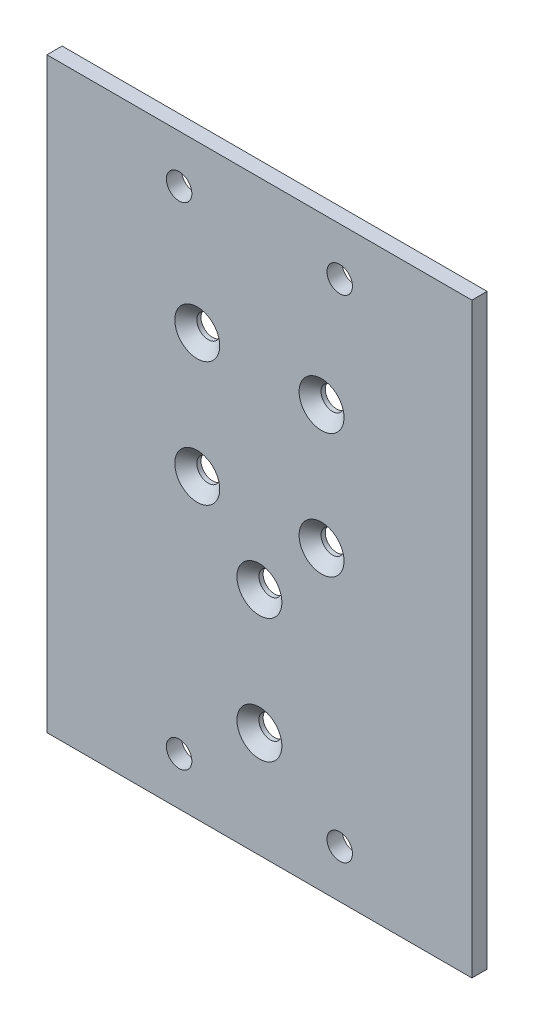
ISO-10303-21;
HEADER;
FILE_DESCRIPTION(('STEP AP214'),'2;1');
FILE_NAME('part.step','',(''),(''),'','','');
FILE_SCHEMA(('AUTOMOTIVE_DESIGN { 1 0 10303 214 1 1 1 1 }'));
ENDSEC;
DATA;
#1=APPLICATION_CONTEXT('core data for automotive mechanical design processes');
#2=APPLICATION_PROTOCOL_DEFINITION('international standard','automotive_design',2000,#1);
#3=PRODUCT_CONTEXT('',#1,'mechanical');
#4=PRODUCT('Part','Part','',(#3));
#5=PRODUCT_RELATED_PRODUCT_CATEGORY('part','',(#4));
#6=PRODUCT_DEFINITION_FORMATION('','',#4);
#7=PRODUCT_DEFINITION_CONTEXT('part definition',#1,'design');
#8=PRODUCT_DEFINITION('design','',#6,#7);
#9=PRODUCT_DEFINITION_SHAPE('','',#8);
#10=(LENGTH_UNIT() NAMED_UNIT(*) SI_UNIT(.MILLI.,.METRE.));
#11=(NAMED_UNIT(*) PLANE_ANGLE_UNIT() SI_UNIT($,.RADIAN.));
#12=(NAMED_UNIT(*) SI_UNIT($,.STERADIAN.) SOLID_ANGLE_UNIT());
#13=UNCERTAINTY_MEASURE_WITH_UNIT(LENGTH_MEASURE(1.E-05),#10,'distance_accuracy_value','');
#14=(GEOMETRIC_REPRESENTATION_CONTEXT(3) GLOBAL_UNCERTAINTY_ASSIGNED_CONTEXT((#13)) GLOBAL_UNIT_ASSIGNED_CONTEXT((#10,
#11,#12)) REPRESENTATION_CONTEXT('',''));
#15=CARTESIAN_POINT('',(0.,0.,0.));
#16=DIRECTION('',(0.,0.,1.));
#17=DIRECTION('',(1.,0.,0.));
#18=AXIS2_PLACEMENT_3D('',#15,#16,#17);
#19=CARTESIAN_POINT('',(13.,0.754499999999995,3.17499999999882));
#20=DIRECTION('',(0.,0.,1.));
#21=DIRECTION('',(1.,0.,0.));
#22=AXIS2_PLACEMENT_3D('',#19,#20,#21);
#23=CONICAL_SURFACE('',#22,4.69999999993388,0.785398163409806);
#24=CARTESIAN_POINT('',(13.,0.754499999999995,3.17499999996517));
#25=DIRECTION('',(0.,0.,1.));
#26=DIRECTION('',(1.,0.,0.));
#27=AXIS2_PLACEMENT_3D('',#24,#25,#26);
#28=CIRCLE('',#27,4.69999999990023);
#29=CARTESIAN_POINT('',(17.6999999999002,0.754499999999995,3.17499999996517));
#30=VERTEX_POINT('',#29);
#31=EDGE_CURVE('E153',#30,#30,#28,.T.);
#32=ORIENTED_EDGE('',*,*,#31,.T.);
#33=EDGE_LOOP('',(#32));
#34=FACE_BOUND('',#33,.T.);
#35=CARTESIAN_POINT('',(13.,0.754499999999995,0.875));
#36=DIRECTION('',(0.,0.,1.));
#37=DIRECTION('',(1.,0.,0.));
#38=AXIS2_PLACEMENT_3D('',#35,#36,#37);
#39=CIRCLE('',#38,2.4);
#40=CARTESIAN_POINT('',(15.4,0.754499999999995,0.875));
#41=VERTEX_POINT('',#40);
#42=EDGE_CURVE('E100',#41,#41,#39,.F.);
#43=ORIENTED_EDGE('',*,*,#42,.T.);
#44=EDGE_LOOP('',(#43));
#45=FACE_BOUND('',#44,.T.);
#46=ADVANCED_FACE('F17',(#34,#45),#23,.F.);
#47=CARTESIAN_POINT('',(0.,-39.2455,3.17499999988513));
#48=DIRECTION('',(0.,0.,1.));
#49=DIRECTION('',(1.,0.,0.));
#50=AXIS2_PLACEMENT_3D('',#47,#48,#49);
#51=CONICAL_SURFACE('',#50,4.69999999990022,0.785398163397448);
#52=CARTESIAN_POINT('',(0.,-39.2455,3.17499999994197));
#53=DIRECTION('',(0.,0.,1.));
#54=DIRECTION('',(1.,0.,0.));
#55=AXIS2_PLACEMENT_3D('',#52,#53,#54);
#56=CIRCLE('',#55,4.69999999995707);
#57=CARTESIAN_POINT('',(4.69999999995707,-39.2455,3.17499999994197));
#58=VERTEX_POINT('',#57);
#59=EDGE_CURVE('E20',#58,#58,#56,.T.);
#60=ORIENTED_EDGE('',*,*,#59,.T.);
#61=EDGE_LOOP('',(#60));
#62=FACE_BOUND('',#61,.T.);
#63=CARTESIAN_POINT('',(0.,-39.2455,0.875));
#64=DIRECTION('',(0.,0.,1.));
#65=DIRECTION('',(1.,0.,0.));
#66=AXIS2_PLACEMENT_3D('',#63,#64,#65);
#67=CIRCLE('',#66,2.4);
#68=CARTESIAN_POINT('',(2.4,-39.2455,0.875));
#69=VERTEX_POINT('',#68);
#70=EDGE_CURVE('E74',#69,#69,#67,.F.);
#71=ORIENTED_EDGE('',*,*,#70,.T.);
#72=EDGE_LOOP('',(#71));
#73=FACE_BOUND('',#72,.T.);
#74=ADVANCED_FACE('F160',(#62,#73),#51,.F.);
#75=CARTESIAN_POINT('',(0.,0.,3.175));
#76=DIRECTION('',(0.,0.,-1.));
#77=DIRECTION('',(-1.,0.,0.));
#78=AXIS2_PLACEMENT_3D('',#75,#76,#77);
#79=PLANE('',#78);
#80=ORIENTED_EDGE('',*,*,#31,.F.);
#81=EDGE_LOOP('',(#80));
#82=FACE_BOUND('',#81,.T.);
#83=CARTESIAN_POINT('',(0.,-13.2455,3.17499999994197));
#84=DIRECTION('',(0.,0.,1.));
#85=DIRECTION('',(1.,0.,0.));
#86=AXIS2_PLACEMENT_3D('',#83,#84,#85);
#87=CIRCLE('',#86,4.69999999995707);
#88=CARTESIAN_POINT('',(4.69999999995707,-13.2455,3.17499999994197));
#89=VERTEX_POINT('',#88);
#90=EDGE_CURVE('E151',#89,#89,#87,.F.);
#91=ORIENTED_EDGE('',*,*,#90,.T.);
#92=EDGE_LOOP('',(#91));
#93=FACE_BOUND('',#92,.T.);
#94=ORIENTED_EDGE('',*,*,#59,.F.);
#95=EDGE_LOOP('',(#94));
#96=FACE_BOUND('',#95,.T.);
#97=DIRECTION('',(1.,0.,0.));
#98=VECTOR('',#97,1.);
#99=CARTESIAN_POINT('',(-44.45,61.4045,3.175));
#100=LINE('',#99,#98);
#101=CARTESIAN_POINT('',(44.45,61.4045,3.175));
#102=VERTEX_POINT('',#101);
#103=CARTESIAN_POINT('',(-44.45,61.4045,3.175));
#104=VERTEX_POINT('',#103);
#105=EDGE_CURVE('E287',#102,#104,#100,.F.);
#106=ORIENTED_EDGE('',*,*,#105,.T.);
#107=DIRECTION('',(0.,1.,0.));
#108=VECTOR('',#107,1.);
#109=CARTESIAN_POINT('',(-44.45,-61.4045,3.175));
#110=LINE('',#109,#108);
#111=CARTESIAN_POINT('',(-44.45,-61.4045,3.175));
#112=VERTEX_POINT('',#111);
#113=EDGE_CURVE('E55',#104,#112,#110,.F.);
#114=ORIENTED_EDGE('',*,*,#113,.T.);
#115=DIRECTION('',(1.,0.,0.));
#116=VECTOR('',#115,1.);
#117=CARTESIAN_POINT('',(-44.45,-61.4045,3.175));
#118=LINE('',#117,#116);
#119=CARTESIAN_POINT('',(44.45,-61.4045,3.175));
#120=VERTEX_POINT('',#119);
#121=EDGE_CURVE('E57',#112,#120,#118,.T.);
#122=ORIENTED_EDGE('',*,*,#121,.T.);
#123=DIRECTION('',(0.,1.,0.));
#124=VECTOR('',#123,1.);
#125=CARTESIAN_POINT('',(44.45,-61.4045,3.175));
#126=LINE('',#125,#124);
#127=EDGE_CURVE('E61',#120,#102,#126,.T.);
#128=ORIENTED_EDGE('',*,*,#127,.T.);
#129=EDGE_LOOP('',(#106,#114,#122,#128));
#130=FACE_BOUND('',#129,.T.);
#131=CARTESIAN_POINT('',(-13.,0.754499999999995,3.17499999999882));
#132=DIRECTION('',(0.,0.,1.));
#133=DIRECTION('',(0.,-1.,0.));
#134=AXIS2_PLACEMENT_3D('',#131,#132,#133);
#135=CIRCLE('',#134,4.69999999998026);
#136=CARTESIAN_POINT('',(-13.,-3.94549999998027,3.17499999999882));
#137=VERTEX_POINT('',#136);
#138=EDGE_CURVE('E148',#137,#137,#135,.F.);
#139=ORIENTED_EDGE('',*,*,#138,.T.);
#140=EDGE_LOOP('',(#139));
#141=FACE_BOUND('',#140,.T.);
#142=CARTESIAN_POINT('',(-13.,26.7545,3.17499999999882));
#143=DIRECTION('',(0.,0.,1.));
#144=DIRECTION('',(0.,-1.,0.));
#145=AXIS2_PLACEMENT_3D('',#142,#143,#144);
#146=CIRCLE('',#145,4.69999999998026);
#147=CARTESIAN_POINT('',(-13.,22.0545000000197,3.17499999999882));
#148=VERTEX_POINT('',#147);
#149=EDGE_CURVE('E145',#148,#148,#146,.F.);
#150=ORIENTED_EDGE('',*,*,#149,.T.);
#151=EDGE_LOOP('',(#150));
#152=FACE_BOUND('',#151,.T.);
#153=CARTESIAN_POINT('',(13.,26.7545,3.17499999999882));
#154=DIRECTION('',(0.,0.,1.));
#155=DIRECTION('',(1.,0.,0.));
#156=AXIS2_PLACEMENT_3D('',#153,#154,#155);
#157=CIRCLE('',#156,4.69999999993388);
#158=CARTESIAN_POINT('',(17.6999999999339,26.7545,3.17499999999882));
#159=VERTEX_POINT('',#158);
#160=EDGE_CURVE('E142',#159,#159,#157,.F.);
#161=ORIENTED_EDGE('',*,*,#160,.T.);
#162=EDGE_LOOP('',(#161));
#163=FACE_BOUND('',#162,.T.);
#164=CARTESIAN_POINT('',(-16.8,51.4045,3.175));
#165=DIRECTION('',(0.,0.,1.));
#166=DIRECTION('',(1.,0.,0.));
#167=AXIS2_PLACEMENT_3D('',#164,#165,#166);
#168=CIRCLE('',#167,2.665);
#169=CARTESIAN_POINT('',(-14.135,51.4045,3.175));
#170=VERTEX_POINT('',#169);
#171=EDGE_CURVE('E102',#170,#170,#168,.F.);
#172=ORIENTED_EDGE('',*,*,#171,.T.);
#173=EDGE_LOOP('',(#172));
#174=FACE_BOUND('',#173,.T.);
#175=CARTESIAN_POINT('',(16.8,51.4045,3.175));
#176=DIRECTION('',(0.,0.,1.));
#177=DIRECTION('',(1.,0.,0.));
#178=AXIS2_PLACEMENT_3D('',#175,#176,#177);
#179=CIRCLE('',#178,2.665);
#180=CARTESIAN_POINT('',(19.465,51.4045,3.175));
#181=VERTEX_POINT('',#180);
#182=EDGE_CURVE('E133',#181,#181,#179,.F.);
#183=ORIENTED_EDGE('',*,*,#182,.T.);
#184=EDGE_LOOP('',(#183));
#185=FACE_BOUND('',#184,.T.);
#186=CARTESIAN_POINT('',(-16.8,-51.4045,3.175));
#187=DIRECTION('',(0.,0.,1.));
#188=DIRECTION('',(1.,0.,0.));
#189=AXIS2_PLACEMENT_3D('',#186,#187,#188);
#190=CIRCLE('',#189,2.665);
#191=CARTESIAN_POINT('',(-14.135,-51.4045,3.175));
#192=VERTEX_POINT('',#191);
#193=EDGE_CURVE('E136',#192,#192,#190,.F.);
#194=ORIENTED_EDGE('',*,*,#193,.T.);
#195=EDGE_LOOP('',(#194));
#196=FACE_BOUND('',#195,.T.);
#197=CARTESIAN_POINT('',(16.8,-51.4045,3.175));
#198=DIRECTION('',(0.,0.,1.));
#199=DIRECTION('',(1.,0.,0.));
#200=AXIS2_PLACEMENT_3D('',#197,#198,#199);
#201=CIRCLE('',#200,2.665);
#202=CARTESIAN_POINT('',(19.465,-51.4045,3.175));
#203=VERTEX_POINT('',#202);
#204=EDGE_CURVE('E139',#203,#203,#201,.F.);
#205=ORIENTED_EDGE('',*,*,#204,.T.);
#206=EDGE_LOOP('',(#205));
#207=FACE_BOUND('',#206,.T.);
#208=ADVANCED_FACE('F59',(#82,#93,#96,#130,#141,#152,#163,#174,#185,#196,#207),#79,.F.);
#209=CARTESIAN_POINT('',(0.,-13.2455,3.17499999988513));
#210=DIRECTION('',(0.,0.,1.));
#211=DIRECTION('',(1.,0.,0.));
#212=AXIS2_PLACEMENT_3D('',#209,#210,#211);
#213=CONICAL_SURFACE('',#212,4.69999999990023,0.785398163397448);
#214=ORIENTED_EDGE('',*,*,#90,.F.);
#215=EDGE_LOOP('',(#214));
#216=FACE_BOUND('',#215,.T.);
#217=CARTESIAN_POINT('',(0.,-13.2455,0.875));
#218=DIRECTION('',(0.,0.,1.));
#219=DIRECTION('',(1.,0.,0.));
#220=AXIS2_PLACEMENT_3D('',#217,#218,#219);
#221=CIRCLE('',#220,2.4);
#222=CARTESIAN_POINT('',(2.4,-13.2455,0.875));
#223=VERTEX_POINT('',#222);
#224=EDGE_CURVE('E95',#223,#223,#221,.F.);
#225=ORIENTED_EDGE('',*,*,#224,.T.);
#226=EDGE_LOOP('',(#225));
#227=FACE_BOUND('',#226,.T.);
#228=ADVANCED_FACE('F164',(#216,#227),#213,.F.);
#229=CARTESIAN_POINT('',(-13.,0.754499999999995,3.17499999994197));
#230=DIRECTION('',(0.,0.,1.));
#231=DIRECTION('',(0.,-1.,0.));
#232=AXIS2_PLACEMENT_3D('',#229,#230,#231);
#233=CONICAL_SURFACE('',#232,4.69999999992342,0.785398163397448);
#234=ORIENTED_EDGE('',*,*,#138,.F.);
#235=EDGE_LOOP('',(#234));
#236=FACE_BOUND('',#235,.T.);
#237=CARTESIAN_POINT('',(-13.,0.754499999999995,0.875));
#238=DIRECTION('',(0.,0.,1.));
#239=DIRECTION('',(1.,0.,0.));
#240=AXIS2_PLACEMENT_3D('',#237,#238,#239);
#241=CIRCLE('',#240,2.4);
#242=CARTESIAN_POINT('',(-10.6,0.754499999999995,0.875));
#243=VERTEX_POINT('',#242);
#244=EDGE_CURVE('E92',#243,#243,#241,.F.);
#245=ORIENTED_EDGE('',*,*,#244,.T.);
#246=EDGE_LOOP('',(#245));
#247=FACE_BOUND('',#246,.T.);
#248=ADVANCED_FACE('F172',(#236,#247),#233,.F.);
#249=CARTESIAN_POINT('',(-13.,26.7545,3.17499999994197));
#250=DIRECTION('',(0.,0.,1.));
#251=DIRECTION('',(0.,-1.,0.));
#252=AXIS2_PLACEMENT_3D('',#249,#250,#251);
#253=CONICAL_SURFACE('',#252,4.69999999992342,0.785398163397448);
#254=ORIENTED_EDGE('',*,*,#149,.F.);
#255=EDGE_LOOP('',(#254));
#256=FACE_BOUND('',#255,.T.);
#257=CARTESIAN_POINT('',(-13.,26.7545,0.875));
#258=DIRECTION('',(0.,0.,1.));
#259=DIRECTION('',(1.,0.,0.));
#260=AXIS2_PLACEMENT_3D('',#257,#258,#259);
#261=CIRCLE('',#260,2.4);
#262=CARTESIAN_POINT('',(-10.6,26.7545,0.875));
#263=VERTEX_POINT('',#262);
#264=EDGE_CURVE('E89',#263,#263,#261,.F.);
#265=ORIENTED_EDGE('',*,*,#264,.T.);
#266=EDGE_LOOP('',(#265));
#267=FACE_BOUND('',#266,.T.);
#268=ADVANCED_FACE('F238',(#256,#267),#253,.F.);
#269=CARTESIAN_POINT('',(13.,26.7545,3.17499999999882));
#270=DIRECTION('',(0.,0.,1.));
#271=DIRECTION('',(1.,0.,0.));
#272=AXIS2_PLACEMENT_3D('',#269,#270,#271);
#273=CONICAL_SURFACE('',#272,4.69999999993388,0.785398163409806);
#274=ORIENTED_EDGE('',*,*,#160,.F.);
#275=EDGE_LOOP('',(#274));
#276=FACE_BOUND('',#275,.T.);
#277=CARTESIAN_POINT('',(13.,26.7545,0.875));
#278=DIRECTION('',(0.,0.,1.));
#279=DIRECTION('',(1.,0.,0.));
#280=AXIS2_PLACEMENT_3D('',#277,#278,#279);
#281=CIRCLE('',#280,2.4);
#282=CARTESIAN_POINT('',(15.4,26.7545,0.875));
#283=VERTEX_POINT('',#282);
#284=EDGE_CURVE('E85',#283,#283,#281,.F.);
#285=ORIENTED_EDGE('',*,*,#284,.T.);
#286=EDGE_LOOP('',(#285));
#287=FACE_BOUND('',#286,.T.);
#288=ADVANCED_FACE('F234',(#276,#287),#273,.F.);
#289=CARTESIAN_POINT('',(16.8,-51.4045,-0.00100000000000013));
#290=DIRECTION('',(0.,0.,1.));
#291=DIRECTION('',(1.,0.,0.));
#292=AXIS2_PLACEMENT_3D('',#289,#290,#291);
#293=CYLINDRICAL_SURFACE('',#292,2.665);
#294=CARTESIAN_POINT('',(16.8,-51.4045,0.));
#295=DIRECTION('',(0.,0.,1.));
#296=DIRECTION('',(1.,0.,0.));
#297=AXIS2_PLACEMENT_3D('',#294,#295,#296);
#298=CIRCLE('',#297,2.665);
#299=CARTESIAN_POINT('',(19.465,-51.4045,0.));
#300=VERTEX_POINT('',#299);
#301=EDGE_CURVE('E88',#300,#300,#298,.T.);
#302=ORIENTED_EDGE('',*,*,#301,.F.);
#303=EDGE_LOOP('',(#302));
#304=FACE_BOUND('',#303,.T.);
#305=ORIENTED_EDGE('',*,*,#204,.F.);
#306=EDGE_LOOP('',(#305));
#307=FACE_BOUND('',#306,.T.);
#308=ADVANCED_FACE('F230',(#304,#307),#293,.F.);
#309=CARTESIAN_POINT('',(-16.8,-51.4045,-0.00100000000000013));
#310=DIRECTION('',(0.,0.,1.));
#311=DIRECTION('',(1.,0.,0.));
#312=AXIS2_PLACEMENT_3D('',#309,#310,#311);
#313=CYLINDRICAL_SURFACE('',#312,2.665);
#314=CARTESIAN_POINT('',(-16.8,-51.4045,0.));
#315=DIRECTION('',(0.,0.,1.));
#316=DIRECTION('',(1.,0.,0.));
#317=AXIS2_PLACEMENT_3D('',#314,#315,#316);
#318=CIRCLE('',#317,2.665);
#319=CARTESIAN_POINT('',(-14.135,-51.4045,0.));
#320=VERTEX_POINT('',#319);
#321=EDGE_CURVE('E126',#320,#320,#318,.T.);
#322=ORIENTED_EDGE('',*,*,#321,.F.);
#323=EDGE_LOOP('',(#322));
#324=FACE_BOUND('',#323,.T.);
#325=ORIENTED_EDGE('',*,*,#193,.F.);
#326=EDGE_LOOP('',(#325));
#327=FACE_BOUND('',#326,.T.);
#328=ADVANCED_FACE('F226',(#324,#327),#313,.F.);
#329=CARTESIAN_POINT('',(16.8,51.4045,-0.00100000000000013));
#330=DIRECTION('',(0.,0.,1.));
#331=DIRECTION('',(1.,0.,0.));
#332=AXIS2_PLACEMENT_3D('',#329,#330,#331);
#333=CYLINDRICAL_SURFACE('',#332,2.665);
#334=ORIENTED_EDGE('',*,*,#182,.F.);
#335=EDGE_LOOP('',(#334));
#336=FACE_BOUND('',#335,.T.);
#337=CARTESIAN_POINT('',(16.8,51.4045,0.));
#338=DIRECTION('',(0.,0.,1.));
#339=DIRECTION('',(1.,0.,0.));
#340=AXIS2_PLACEMENT_3D('',#337,#338,#339);
#341=CIRCLE('',#340,2.665);
#342=CARTESIAN_POINT('',(19.465,51.4045,0.));
#343=VERTEX_POINT('',#342);
#344=EDGE_CURVE('E123',#343,#343,#341,.T.);
#345=ORIENTED_EDGE('',*,*,#344,.F.);
#346=EDGE_LOOP('',(#345));
#347=FACE_BOUND('',#346,.T.);
#348=ADVANCED_FACE('F222',(#336,#347),#333,.F.);
#349=CARTESIAN_POINT('',(-16.8,51.4045,-0.00100000000000013));
#350=DIRECTION('',(0.,0.,1.));
#351=DIRECTION('',(1.,0.,0.));
#352=AXIS2_PLACEMENT_3D('',#349,#350,#351);
#353=CYLINDRICAL_SURFACE('',#352,2.665);
#354=ORIENTED_EDGE('',*,*,#171,.F.);
#355=EDGE_LOOP('',(#354));
#356=FACE_BOUND('',#355,.T.);
#357=CARTESIAN_POINT('',(-16.8,51.4045,0.));
#358=DIRECTION('',(0.,0.,1.));
#359=DIRECTION('',(1.,0.,0.));
#360=AXIS2_PLACEMENT_3D('',#357,#358,#359);
#361=CIRCLE('',#360,2.665);
#362=CARTESIAN_POINT('',(-14.135,51.4045,0.));
#363=VERTEX_POINT('',#362);
#364=EDGE_CURVE('E120',#363,#363,#361,.T.);
#365=ORIENTED_EDGE('',*,*,#364,.F.);
#366=EDGE_LOOP('',(#365));
#367=FACE_BOUND('',#366,.T.);
#368=ADVANCED_FACE('F218',(#356,#367),#353,.F.);
#369=CARTESIAN_POINT('',(13.,0.754499999999995,3.175));
#370=DIRECTION('',(0.,0.,1.));
#371=DIRECTION('',(1.,0.,0.));
#372=AXIS2_PLACEMENT_3D('',#369,#370,#371);
#373=CYLINDRICAL_SURFACE('',#372,2.4);
#374=ORIENTED_EDGE('',*,*,#42,.F.);
#375=EDGE_LOOP('',(#374));
#376=FACE_BOUND('',#375,.T.);
#377=CARTESIAN_POINT('',(13.,0.754499999999995,0.));
#378=DIRECTION('',(0.,0.,1.));
#379=DIRECTION('',(1.,0.,0.));
#380=AXIS2_PLACEMENT_3D('',#377,#378,#379);
#381=CIRCLE('',#380,2.4);
#382=CARTESIAN_POINT('',(15.4,0.754499999999995,0.));
#383=VERTEX_POINT('',#382);
#384=EDGE_CURVE('E117',#383,#383,#381,.T.);
#385=ORIENTED_EDGE('',*,*,#384,.F.);
#386=EDGE_LOOP('',(#385));
#387=FACE_BOUND('',#386,.T.);
#388=ADVANCED_FACE('F214',(#376,#387),#373,.F.);
#389=CARTESIAN_POINT('',(0.,-39.2455,3.175));
#390=DIRECTION('',(0.,0.,1.));
#391=DIRECTION('',(1.,0.,0.));
#392=AXIS2_PLACEMENT_3D('',#389,#390,#391);
#393=CYLINDRICAL_SURFACE('',#392,2.4);
#394=ORIENTED_EDGE('',*,*,#70,.F.);
#395=EDGE_LOOP('',(#394));
#396=FACE_BOUND('',#395,.T.);
#397=CARTESIAN_POINT('',(0.,-39.2455,0.));
#398=DIRECTION('',(0.,0.,1.));
#399=DIRECTION('',(1.,0.,0.));
#400=AXIS2_PLACEMENT_3D('',#397,#398,#399);
#401=CIRCLE('',#400,2.4);
#402=CARTESIAN_POINT('',(2.4,-39.2455,0.));
#403=VERTEX_POINT('',#402);
#404=EDGE_CURVE('E113',#403,#403,#401,.T.);
#405=ORIENTED_EDGE('',*,*,#404,.F.);
#406=EDGE_LOOP('',(#405));
#407=FACE_BOUND('',#406,.T.);
#408=ADVANCED_FACE('F211',(#396,#407),#393,.F.);
#409=CARTESIAN_POINT('',(44.45,-61.4045,3.175));
#410=DIRECTION('',(-1.,0.,0.));
#411=DIRECTION('',(0.,0.,1.));
#412=AXIS2_PLACEMENT_3D('',#409,#410,#411);
#413=PLANE('',#412);
#414=DIRECTION('',(0.,0.,-1.));
#415=VECTOR('',#414,1.);
#416=CARTESIAN_POINT('',(44.45,61.4045,3.175));
#417=LINE('',#416,#415);
#418=CARTESIAN_POINT('',(44.45,61.4045,0.));
#419=VERTEX_POINT('',#418);
#420=EDGE_CURVE('E72',#419,#102,#417,.F.);
#421=ORIENTED_EDGE('',*,*,#420,.T.);
#422=ORIENTED_EDGE('',*,*,#127,.F.);
#423=DIRECTION('',(0.,0.,1.));
#424=VECTOR('',#423,1.);
#425=CARTESIAN_POINT('',(44.45,-61.4045,3.175));
#426=LINE('',#425,#424);
#427=CARTESIAN_POINT('',(44.45,-61.4045,0.));
#428=VERTEX_POINT('',#427);
#429=EDGE_CURVE('E66',#120,#428,#426,.F.);
#430=ORIENTED_EDGE('',*,*,#429,.T.);
#431=DIRECTION('',(0.,1.,0.));
#432=VECTOR('',#431,1.);
#433=CARTESIAN_POINT('',(44.45,0.,0.));
#434=LINE('',#433,#432);
#435=EDGE_CURVE('E116',#419,#428,#434,.F.);
#436=ORIENTED_EDGE('',*,*,#435,.F.);
#437=EDGE_LOOP('',(#421,#422,#430,#436));
#438=FACE_BOUND('',#437,.T.);
#439=ADVANCED_FACE('F69',(#438),#413,.F.);
#440=CARTESIAN_POINT('',(-44.45,-61.4045,3.175));
#441=DIRECTION('',(0.,1.,0.));
#442=DIRECTION('',(0.,0.,1.));
#443=AXIS2_PLACEMENT_3D('',#440,#441,#442);
#444=PLANE('',#443);
#445=ORIENTED_EDGE('',*,*,#429,.F.);
#446=ORIENTED_EDGE('',*,*,#121,.F.);
#447=DIRECTION('',(0.,0.,-1.));
#448=VECTOR('',#447,1.);
#449=CARTESIAN_POINT('',(-44.45,-61.4045,3.175));
#450=LINE('',#449,#448);
#451=CARTESIAN_POINT('',(-44.45,-61.4045,0.));
#452=VERTEX_POINT('',#451);
#453=EDGE_CURVE('E81',#112,#452,#450,.T.);
#454=ORIENTED_EDGE('',*,*,#453,.T.);
#455=DIRECTION('',(-1.,0.,0.));
#456=VECTOR('',#455,1.);
#457=CARTESIAN_POINT('',(0.,-61.4045,0.));
#458=LINE('',#457,#456);
#459=EDGE_CURVE('E78',#428,#452,#458,.T.);
#460=ORIENTED_EDGE('',*,*,#459,.F.);
#461=EDGE_LOOP('',(#445,#446,#454,#460));
#462=FACE_BOUND('',#461,.T.);
#463=ADVANCED_FACE('F76',(#462),#444,.F.);
#464=CARTESIAN_POINT('',(-44.45,-61.4045,3.175));
#465=DIRECTION('',(1.,0.,0.));
#466=DIRECTION('',(0.,0.,-1.));
#467=AXIS2_PLACEMENT_3D('',#464,#465,#466);
#468=PLANE('',#467);
#469=ORIENTED_EDGE('',*,*,#453,.F.);
#470=ORIENTED_EDGE('',*,*,#113,.F.);
#471=DIRECTION('',(0.,0.,-1.));
#472=VECTOR('',#471,1.);
#473=CARTESIAN_POINT('',(-44.45,61.4045,3.175));
#474=LINE('',#473,#472);
#475=CARTESIAN_POINT('',(-44.45,61.4045,0.));
#476=VERTEX_POINT('',#475);
#477=EDGE_CURVE('E35',#104,#476,#474,.T.);
#478=ORIENTED_EDGE('',*,*,#477,.T.);
#479=DIRECTION('',(0.,1.,0.));
#480=VECTOR('',#479,1.);
#481=CARTESIAN_POINT('',(-44.45,0.,0.));
#482=LINE('',#481,#480);
#483=EDGE_CURVE('E259',#452,#476,#482,.T.);
#484=ORIENTED_EDGE('',*,*,#483,.F.);
#485=EDGE_LOOP('',(#469,#470,#478,#484));
#486=FACE_BOUND('',#485,.T.);
#487=ADVANCED_FACE('F203',(#486),#468,.F.);
#488=CARTESIAN_POINT('',(-44.45,61.4045,3.175));
#489=DIRECTION('',(0.,-1.,0.));
#490=DIRECTION('',(0.,0.,-1.));
#491=AXIS2_PLACEMENT_3D('',#488,#489,#490);
#492=PLANE('',#491);
#493=ORIENTED_EDGE('',*,*,#477,.F.);
#494=ORIENTED_EDGE('',*,*,#105,.F.);
#495=ORIENTED_EDGE('',*,*,#420,.F.);
#496=DIRECTION('',(-1.,0.,0.));
#497=VECTOR('',#496,1.);
#498=CARTESIAN_POINT('',(0.,61.4045,0.));
#499=LINE('',#498,#497);
#500=EDGE_CURVE('E112',#476,#419,#499,.F.);
#501=ORIENTED_EDGE('',*,*,#500,.F.);
#502=EDGE_LOOP('',(#493,#494,#495,#501));
#503=FACE_BOUND('',#502,.T.);
#504=ADVANCED_FACE('F199',(#503),#492,.F.);
#505=CARTESIAN_POINT('',(0.,-13.2455,3.175));
#506=DIRECTION('',(0.,0.,1.));
#507=DIRECTION('',(1.,0.,0.));
#508=AXIS2_PLACEMENT_3D('',#505,#506,#507);
#509=CYLINDRICAL_SURFACE('',#508,2.4);
#510=ORIENTED_EDGE('',*,*,#224,.F.);
#511=EDGE_LOOP('',(#510));
#512=FACE_BOUND('',#511,.T.);
#513=CARTESIAN_POINT('',(0.,-13.2455,0.));
#514=DIRECTION('',(0.,0.,1.));
#515=DIRECTION('',(1.,0.,0.));
#516=AXIS2_PLACEMENT_3D('',#513,#514,#515);
#517=CIRCLE('',#516,2.4);
#518=CARTESIAN_POINT('',(2.4,-13.2455,0.));
#519=VERTEX_POINT('',#518);
#520=EDGE_CURVE('E109',#519,#519,#517,.T.);
#521=ORIENTED_EDGE('',*,*,#520,.F.);
#522=EDGE_LOOP('',(#521));
#523=FACE_BOUND('',#522,.T.);
#524=ADVANCED_FACE('F195',(#512,#523),#509,.F.);
#525=CARTESIAN_POINT('',(-13.,0.754499999999995,3.175));
#526=DIRECTION('',(0.,0.,1.));
#527=DIRECTION('',(1.,0.,0.));
#528=AXIS2_PLACEMENT_3D('',#525,#526,#527);
#529=CYLINDRICAL_SURFACE('',#528,2.4);
#530=ORIENTED_EDGE('',*,*,#244,.F.);
#531=EDGE_LOOP('',(#530));
#532=FACE_BOUND('',#531,.T.);
#533=CARTESIAN_POINT('',(-13.,0.754499999999995,0.));
#534=DIRECTION('',(0.,0.,1.));
#535=DIRECTION('',(1.,0.,0.));
#536=AXIS2_PLACEMENT_3D('',#533,#534,#535);
#537=CIRCLE('',#536,2.4);
#538=CARTESIAN_POINT('',(-10.6,0.754499999999995,0.));
#539=VERTEX_POINT('',#538);
#540=EDGE_CURVE('E106',#539,#539,#537,.T.);
#541=ORIENTED_EDGE('',*,*,#540,.F.);
#542=EDGE_LOOP('',(#541));
#543=FACE_BOUND('',#542,.T.);
#544=ADVANCED_FACE('F191',(#532,#543),#529,.F.);
#545=CARTESIAN_POINT('',(-13.,26.7545,3.175));
#546=DIRECTION('',(0.,0.,1.));
#547=DIRECTION('',(1.,0.,0.));
#548=AXIS2_PLACEMENT_3D('',#545,#546,#547);
#549=CYLINDRICAL_SURFACE('',#548,2.4);
#550=ORIENTED_EDGE('',*,*,#264,.F.);
#551=EDGE_LOOP('',(#550));
#552=FACE_BOUND('',#551,.T.);
#553=CARTESIAN_POINT('',(-13.,26.7545,0.));
#554=DIRECTION('',(0.,0.,1.));
#555=DIRECTION('',(1.,0.,0.));
#556=AXIS2_PLACEMENT_3D('',#553,#554,#555);
#557=CIRCLE('',#556,2.4);
#558=CARTESIAN_POINT('',(-10.6,26.7545,0.));
#559=VERTEX_POINT('',#558);
#560=EDGE_CURVE('E26',#559,#559,#557,.T.);
#561=ORIENTED_EDGE('',*,*,#560,.F.);
#562=EDGE_LOOP('',(#561));
#563=FACE_BOUND('',#562,.T.);
#564=ADVANCED_FACE('F184',(#552,#563),#549,.F.);
#565=CARTESIAN_POINT('',(13.,26.7545,3.175));
#566=DIRECTION('',(0.,0.,1.));
#567=DIRECTION('',(1.,0.,0.));
#568=AXIS2_PLACEMENT_3D('',#565,#566,#567);
#569=CYLINDRICAL_SURFACE('',#568,2.4);
#570=ORIENTED_EDGE('',*,*,#284,.F.);
#571=EDGE_LOOP('',(#570));
#572=FACE_BOUND('',#571,.T.);
#573=CARTESIAN_POINT('',(13.,26.7545,0.));
#574=DIRECTION('',(0.,0.,1.));
#575=DIRECTION('',(1.,0.,0.));
#576=AXIS2_PLACEMENT_3D('',#573,#574,#575);
#577=CIRCLE('',#576,2.4);
#578=CARTESIAN_POINT('',(15.4,26.7545,0.));
#579=VERTEX_POINT('',#578);
#580=EDGE_CURVE('E11',#579,#579,#577,.T.);
#581=ORIENTED_EDGE('',*,*,#580,.F.);
#582=EDGE_LOOP('',(#581));
#583=FACE_BOUND('',#582,.T.);
#584=ADVANCED_FACE('F178',(#572,#583),#569,.F.);
#585=CARTESIAN_POINT('',(0.,0.,0.));
#586=DIRECTION('',(0.,0.,-1.));
#587=DIRECTION('',(-1.,0.,0.));
#588=AXIS2_PLACEMENT_3D('',#585,#586,#587);
#589=PLANE('',#588);
#590=ORIENTED_EDGE('',*,*,#580,.T.);
#591=EDGE_LOOP('',(#590));
#592=FACE_BOUND('',#591,.T.);
#593=ORIENTED_EDGE('',*,*,#560,.T.);
#594=EDGE_LOOP('',(#593));
#595=FACE_BOUND('',#594,.T.);
#596=ORIENTED_EDGE('',*,*,#540,.T.);
#597=EDGE_LOOP('',(#596));
#598=FACE_BOUND('',#597,.T.);
#599=ORIENTED_EDGE('',*,*,#520,.T.);
#600=EDGE_LOOP('',(#599));
#601=FACE_BOUND('',#600,.T.);
#602=ORIENTED_EDGE('',*,*,#483,.T.);
#603=ORIENTED_EDGE('',*,*,#500,.T.);
#604=ORIENTED_EDGE('',*,*,#435,.T.);
#605=ORIENTED_EDGE('',*,*,#459,.T.);
#606=EDGE_LOOP('',(#602,#603,#604,#605));
#607=FACE_BOUND('',#606,.T.);
#608=ORIENTED_EDGE('',*,*,#404,.T.);
#609=EDGE_LOOP('',(#608));
#610=FACE_BOUND('',#609,.T.);
#611=ORIENTED_EDGE('',*,*,#384,.T.);
#612=EDGE_LOOP('',(#611));
#613=FACE_BOUND('',#612,.T.);
#614=ORIENTED_EDGE('',*,*,#364,.T.);
#615=EDGE_LOOP('',(#614));
#616=FACE_BOUND('',#615,.T.);
#617=ORIENTED_EDGE('',*,*,#344,.T.);
#618=EDGE_LOOP('',(#617));
#619=FACE_BOUND('',#618,.T.);
#620=ORIENTED_EDGE('',*,*,#321,.T.);
#621=EDGE_LOOP('',(#620));
#622=FACE_BOUND('',#621,.T.);
#623=ORIENTED_EDGE('',*,*,#301,.T.);
#624=EDGE_LOOP('',(#623));
#625=FACE_BOUND('',#624,.T.);
#626=ADVANCED_FACE('F176',(#592,#595,#598,#601,#607,#610,#613,#616,#619,#622,#625),#589,.T.);
#627=CLOSED_SHELL('',(#46,#74,#208,#228,#248,#268,#288,#308,#328,#348,#368,#388,#408,#439,#463,
#487,#504,#524,#544,#564,#584,#626));
#628=MANIFOLD_SOLID_BREP('B1',#627);
#629=ADVANCED_BREP_SHAPE_REPRESENTATION('',(#18,#628),#14);
#630=SHAPE_DEFINITION_REPRESENTATION(#9,#629);
ENDSEC;
END-ISO-10303-21;
